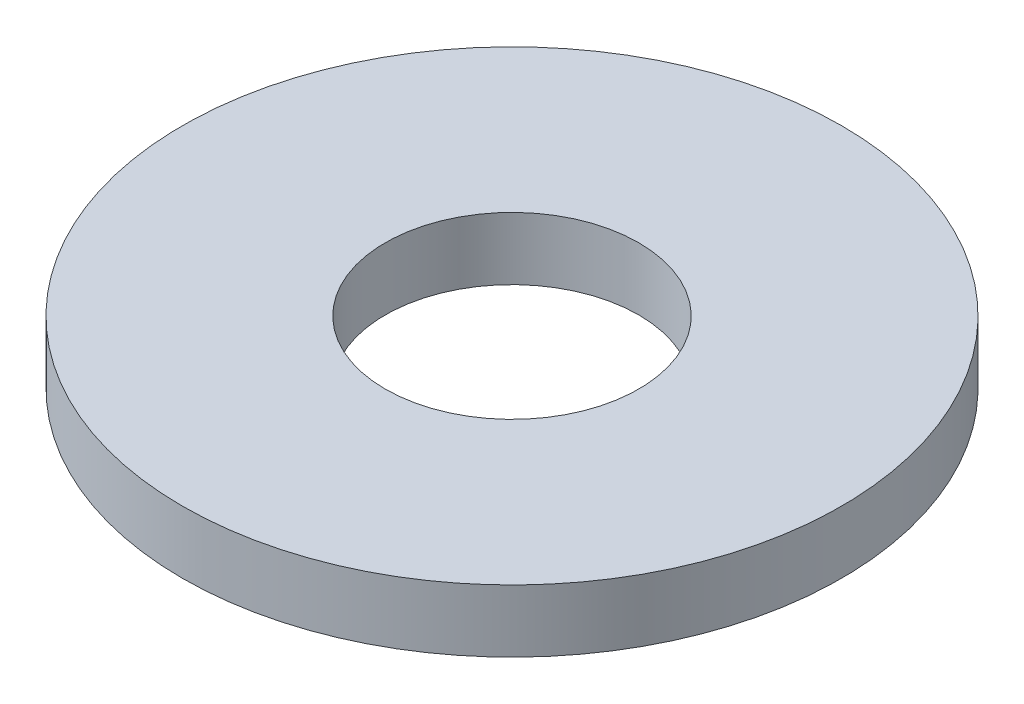
ISO-10303-21;
HEADER;
FILE_DESCRIPTION(('STEP AP214'),'2;1');
FILE_NAME('part.step','',(''),(''),'','','');
FILE_SCHEMA(('AUTOMOTIVE_DESIGN { 1 0 10303 214 1 1 1 1 }'));
ENDSEC;
DATA;
#1=APPLICATION_CONTEXT('core data for automotive mechanical design processes');
#2=APPLICATION_PROTOCOL_DEFINITION('international standard','automotive_design',2000,#1);
#3=PRODUCT_CONTEXT('',#1,'mechanical');
#4=PRODUCT('Part','Part','',(#3));
#5=PRODUCT_RELATED_PRODUCT_CATEGORY('part','',(#4));
#6=PRODUCT_DEFINITION_FORMATION('','',#4);
#7=PRODUCT_DEFINITION_CONTEXT('part definition',#1,'design');
#8=PRODUCT_DEFINITION('design','',#6,#7);
#9=PRODUCT_DEFINITION_SHAPE('','',#8);
#10=(LENGTH_UNIT() NAMED_UNIT(*) SI_UNIT(.MILLI.,.METRE.));
#11=(NAMED_UNIT(*) PLANE_ANGLE_UNIT() SI_UNIT($,.RADIAN.));
#12=(NAMED_UNIT(*) SI_UNIT($,.STERADIAN.) SOLID_ANGLE_UNIT());
#13=UNCERTAINTY_MEASURE_WITH_UNIT(LENGTH_MEASURE(1.E-05),#10,'distance_accuracy_value','');
#14=(GEOMETRIC_REPRESENTATION_CONTEXT(3) GLOBAL_UNCERTAINTY_ASSIGNED_CONTEXT((#13)) GLOBAL_UNIT_ASSIGNED_CONTEXT((#10,
#11,#12)) REPRESENTATION_CONTEXT('',''));
#15=CARTESIAN_POINT('',(0.,0.,0.));
#16=DIRECTION('',(0.,0.,1.));
#17=DIRECTION('',(1.,0.,0.));
#18=AXIS2_PLACEMENT_3D('',#15,#16,#17);
#19=CARTESIAN_POINT('',(0.,0.74,0.));
#20=DIRECTION('',(0.,1.,0.));
#21=DIRECTION('',(0.,0.,1.));
#22=AXIS2_PLACEMENT_3D('',#19,#20,#21);
#23=PLANE('',#22);
#24=CARTESIAN_POINT('',(0.,0.74,0.));
#25=DIRECTION('',(0.,1.,0.));
#26=DIRECTION('',(0.,0.,1.));
#27=AXIS2_PLACEMENT_3D('',#24,#25,#26);
#28=CIRCLE('',#27,3.9);
#29=CARTESIAN_POINT('',(0.,0.74,3.9));
#30=VERTEX_POINT('',#29);
#31=EDGE_CURVE('E10',#30,#30,#28,.T.);
#32=ORIENTED_EDGE('',*,*,#31,.T.);
#33=EDGE_LOOP('',(#32));
#34=FACE_BOUND('',#33,.T.);
#35=CARTESIAN_POINT('',(0.,0.74,0.));
#36=DIRECTION('',(0.,1.,0.));
#37=DIRECTION('',(0.,0.,1.));
#38=AXIS2_PLACEMENT_3D('',#35,#36,#37);
#39=CIRCLE('',#38,1.5);
#40=CARTESIAN_POINT('',(0.,0.74,1.5));
#41=VERTEX_POINT('',#40);
#42=EDGE_CURVE('E44',#41,#41,#39,.T.);
#43=ORIENTED_EDGE('',*,*,#42,.F.);
#44=EDGE_LOOP('',(#43));
#45=FACE_BOUND('',#44,.T.);
#46=ADVANCED_FACE('F33',(#34,#45),#23,.T.);
#47=CARTESIAN_POINT('',(0.,0.,0.));
#48=DIRECTION('',(0.,1.,0.));
#49=DIRECTION('',(0.,0.,1.));
#50=AXIS2_PLACEMENT_3D('',#47,#48,#49);
#51=PLANE('',#50);
#52=CARTESIAN_POINT('',(0.,0.,0.));
#53=DIRECTION('',(0.,1.,0.));
#54=DIRECTION('',(0.,0.,1.));
#55=AXIS2_PLACEMENT_3D('',#52,#53,#54);
#56=CIRCLE('',#55,3.9);
#57=CARTESIAN_POINT('',(0.,0.,3.9));
#58=VERTEX_POINT('',#57);
#59=EDGE_CURVE('E37',#58,#58,#56,.T.);
#60=ORIENTED_EDGE('',*,*,#59,.F.);
#61=EDGE_LOOP('',(#60));
#62=FACE_BOUND('',#61,.T.);
#63=CARTESIAN_POINT('',(0.,0.,0.));
#64=DIRECTION('',(0.,1.,0.));
#65=DIRECTION('',(0.,0.,1.));
#66=AXIS2_PLACEMENT_3D('',#63,#64,#65);
#67=CIRCLE('',#66,1.5);
#68=CARTESIAN_POINT('',(0.,0.,1.5));
#69=VERTEX_POINT('',#68);
#70=EDGE_CURVE('E46',#69,#69,#67,.T.);
#71=ORIENTED_EDGE('',*,*,#70,.T.);
#72=EDGE_LOOP('',(#71));
#73=FACE_BOUND('',#72,.T.);
#74=ADVANCED_FACE('F56',(#62,#73),#51,.F.);
#75=CARTESIAN_POINT('',(0.,0.74,0.));
#76=DIRECTION('',(0.,-1.,0.));
#77=DIRECTION('',(0.,0.,-1.));
#78=AXIS2_PLACEMENT_3D('',#75,#76,#77);
#79=CYLINDRICAL_SURFACE('',#78,3.9);
#80=ORIENTED_EDGE('',*,*,#31,.F.);
#81=EDGE_LOOP('',(#80));
#82=FACE_BOUND('',#81,.T.);
#83=ORIENTED_EDGE('',*,*,#59,.T.);
#84=EDGE_LOOP('',(#83));
#85=FACE_BOUND('',#84,.T.);
#86=ADVANCED_FACE('F35',(#82,#85),#79,.T.);
#87=CARTESIAN_POINT('',(0.,0.74,0.));
#88=DIRECTION('',(0.,-1.,0.));
#89=DIRECTION('',(0.,0.,-1.));
#90=AXIS2_PLACEMENT_3D('',#87,#88,#89);
#91=CYLINDRICAL_SURFACE('',#90,1.5);
#92=ORIENTED_EDGE('',*,*,#42,.T.);
#93=EDGE_LOOP('',(#92));
#94=FACE_BOUND('',#93,.T.);
#95=ORIENTED_EDGE('',*,*,#70,.F.);
#96=EDGE_LOOP('',(#95));
#97=FACE_BOUND('',#96,.T.);
#98=ADVANCED_FACE('F52',(#94,#97),#91,.F.);
#99=CLOSED_SHELL('',(#46,#74,#86,#98));
#100=MANIFOLD_SOLID_BREP('B2',#99);
#101=ADVANCED_BREP_SHAPE_REPRESENTATION('',(#18,#100),#14);
#102=SHAPE_DEFINITION_REPRESENTATION(#9,#101);
ENDSEC;
END-ISO-10303-21;
